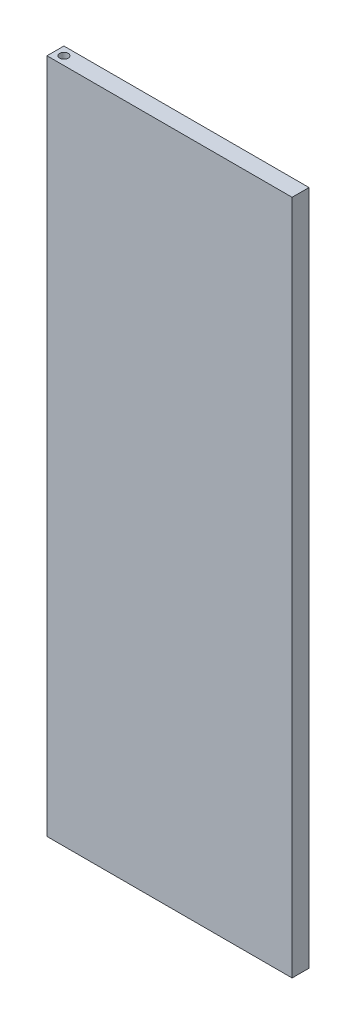
ISO-10303-21;
HEADER;
FILE_DESCRIPTION(('STEP AP214'),'2;1');
FILE_NAME('part.step','',(''),(''),'','','');
FILE_SCHEMA(('AUTOMOTIVE_DESIGN { 1 0 10303 214 1 1 1 1 }'));
ENDSEC;
DATA;
#1=APPLICATION_CONTEXT('core data for automotive mechanical design processes');
#2=APPLICATION_PROTOCOL_DEFINITION('international standard','automotive_design',2000,#1);
#3=PRODUCT_CONTEXT('',#1,'mechanical');
#4=PRODUCT('Part','Part','',(#3));
#5=PRODUCT_RELATED_PRODUCT_CATEGORY('part','',(#4));
#6=PRODUCT_DEFINITION_FORMATION('','',#4);
#7=PRODUCT_DEFINITION_CONTEXT('part definition',#1,'design');
#8=PRODUCT_DEFINITION('design','',#6,#7);
#9=PRODUCT_DEFINITION_SHAPE('','',#8);
#10=(LENGTH_UNIT() NAMED_UNIT(*) SI_UNIT(.MILLI.,.METRE.));
#11=(NAMED_UNIT(*) PLANE_ANGLE_UNIT() SI_UNIT($,.RADIAN.));
#12=(NAMED_UNIT(*) SI_UNIT($,.STERADIAN.) SOLID_ANGLE_UNIT());
#13=UNCERTAINTY_MEASURE_WITH_UNIT(LENGTH_MEASURE(1.E-05),#10,'distance_accuracy_value','');
#14=(GEOMETRIC_REPRESENTATION_CONTEXT(3) GLOBAL_UNCERTAINTY_ASSIGNED_CONTEXT((#13)) GLOBAL_UNIT_ASSIGNED_CONTEXT((#10,
#11,#12)) REPRESENTATION_CONTEXT('',''));
#15=CARTESIAN_POINT('',(0.,0.,0.));
#16=DIRECTION('',(0.,0.,1.));
#17=DIRECTION('',(1.,0.,0.));
#18=AXIS2_PLACEMENT_3D('',#15,#16,#17);
#19=CARTESIAN_POINT('',(0.,-2000.,0.));
#20=DIRECTION('',(1.,0.,0.));
#21=DIRECTION('',(0.,0.,-1.));
#22=AXIS2_PLACEMENT_3D('',#19,#20,#21);
#23=PLANE('',#22);
#24=DIRECTION('',(0.,0.,-1.));
#25=VECTOR('',#24,1.);
#26=CARTESIAN_POINT('',(0.,0.,0.));
#27=LINE('',#26,#25);
#28=CARTESIAN_POINT('',(0.,0.,0.));
#29=VERTEX_POINT('',#28);
#30=CARTESIAN_POINT('',(0.,0.,-50.));
#31=VERTEX_POINT('',#30);
#32=EDGE_CURVE('E100',#29,#31,#27,.T.);
#33=ORIENTED_EDGE('',*,*,#32,.F.);
#34=DIRECTION('',(0.,1.,0.));
#35=VECTOR('',#34,1.);
#36=CARTESIAN_POINT('',(0.,-2000.,0.));
#37=LINE('',#36,#35);
#38=CARTESIAN_POINT('',(0.,-2000.,0.));
#39=VERTEX_POINT('',#38);
#40=EDGE_CURVE('E11',#39,#29,#37,.T.);
#41=ORIENTED_EDGE('',*,*,#40,.F.);
#42=DIRECTION('',(0.,0.,-1.));
#43=VECTOR('',#42,1.);
#44=CARTESIAN_POINT('',(0.,-2000.,0.));
#45=LINE('',#44,#43);
#46=CARTESIAN_POINT('',(0.,-2000.,-50.));
#47=VERTEX_POINT('',#46);
#48=EDGE_CURVE('E93',#39,#47,#45,.T.);
#49=ORIENTED_EDGE('',*,*,#48,.T.);
#50=DIRECTION('',(0.,1.,0.));
#51=VECTOR('',#50,1.);
#52=CARTESIAN_POINT('',(0.,-2000.,-50.));
#53=LINE('',#52,#51);
#54=EDGE_CURVE('E38',#47,#31,#53,.T.);
#55=ORIENTED_EDGE('',*,*,#54,.T.);
#56=EDGE_LOOP('',(#33,#41,#49,#55));
#57=FACE_BOUND('',#56,.T.);
#58=ADVANCED_FACE('F35',(#57),#23,.T.);
#59=CARTESIAN_POINT('',(0.,-2000.,0.));
#60=DIRECTION('',(0.,0.,1.));
#61=DIRECTION('',(1.,0.,0.));
#62=AXIS2_PLACEMENT_3D('',#59,#60,#61);
#63=PLANE('',#62);
#64=DIRECTION('',(1.,0.,0.));
#65=VECTOR('',#64,1.);
#66=CARTESIAN_POINT('',(0.,0.,0.));
#67=LINE('',#66,#65);
#68=CARTESIAN_POINT('',(-725.,0.,0.));
#69=VERTEX_POINT('',#68);
#70=EDGE_CURVE('E95',#69,#29,#67,.T.);
#71=ORIENTED_EDGE('',*,*,#70,.F.);
#72=DIRECTION('',(0.,1.,0.));
#73=VECTOR('',#72,1.);
#74=CARTESIAN_POINT('',(-725.,-2000.,0.));
#75=LINE('',#74,#73);
#76=CARTESIAN_POINT('',(-725.,-2000.,0.));
#77=VERTEX_POINT('',#76);
#78=EDGE_CURVE('E44',#77,#69,#75,.T.);
#79=ORIENTED_EDGE('',*,*,#78,.F.);
#80=DIRECTION('',(1.,0.,0.));
#81=VECTOR('',#80,1.);
#82=CARTESIAN_POINT('',(0.,-2000.,0.));
#83=LINE('',#82,#81);
#84=EDGE_CURVE('E90',#77,#39,#83,.T.);
#85=ORIENTED_EDGE('',*,*,#84,.T.);
#86=ORIENTED_EDGE('',*,*,#40,.T.);
#87=EDGE_LOOP('',(#71,#79,#85,#86));
#88=FACE_BOUND('',#87,.T.);
#89=ADVANCED_FACE('F111',(#88),#63,.T.);
#90=CARTESIAN_POINT('',(-725.,-2000.,0.));
#91=DIRECTION('',(-1.,0.,0.));
#92=DIRECTION('',(0.,0.,1.));
#93=AXIS2_PLACEMENT_3D('',#90,#91,#92);
#94=PLANE('',#93);
#95=DIRECTION('',(0.,0.,1.));
#96=VECTOR('',#95,1.);
#97=CARTESIAN_POINT('',(-725.,0.,0.));
#98=LINE('',#97,#96);
#99=CARTESIAN_POINT('',(-725.,0.,-49.9999999999999));
#100=VERTEX_POINT('',#99);
#101=EDGE_CURVE('E85',#100,#69,#98,.T.);
#102=ORIENTED_EDGE('',*,*,#101,.F.);
#103=DIRECTION('',(0.,1.,0.));
#104=VECTOR('',#103,1.);
#105=CARTESIAN_POINT('',(-725.,-2000.,-49.9999999999999));
#106=LINE('',#105,#104);
#107=CARTESIAN_POINT('',(-725.,-2000.,-49.9999999999999));
#108=VERTEX_POINT('',#107);
#109=EDGE_CURVE('E80',#108,#100,#106,.T.);
#110=ORIENTED_EDGE('',*,*,#109,.F.);
#111=DIRECTION('',(0.,0.,1.));
#112=VECTOR('',#111,1.);
#113=CARTESIAN_POINT('',(-725.,-2000.,0.));
#114=LINE('',#113,#112);
#115=EDGE_CURVE('E83',#108,#77,#114,.T.);
#116=ORIENTED_EDGE('',*,*,#115,.T.);
#117=ORIENTED_EDGE('',*,*,#78,.T.);
#118=EDGE_LOOP('',(#102,#110,#116,#117));
#119=FACE_BOUND('',#118,.T.);
#120=ADVANCED_FACE('F82',(#119),#94,.T.);
#121=CARTESIAN_POINT('',(0.,-2000.,-50.));
#122=DIRECTION('',(0.,0.,-1.));
#123=DIRECTION('',(-1.,0.,0.));
#124=AXIS2_PLACEMENT_3D('',#121,#122,#123);
#125=PLANE('',#124);
#126=DIRECTION('',(-1.,0.,0.));
#127=VECTOR('',#126,1.);
#128=CARTESIAN_POINT('',(0.,0.,-50.));
#129=LINE('',#128,#127);
#130=EDGE_CURVE('E103',#31,#100,#129,.T.);
#131=ORIENTED_EDGE('',*,*,#130,.F.);
#132=ORIENTED_EDGE('',*,*,#54,.F.);
#133=DIRECTION('',(-1.,0.,0.));
#134=VECTOR('',#133,1.);
#135=CARTESIAN_POINT('',(0.,-2000.,-50.));
#136=LINE('',#135,#134);
#137=EDGE_CURVE('E89',#47,#108,#136,.T.);
#138=ORIENTED_EDGE('',*,*,#137,.T.);
#139=ORIENTED_EDGE('',*,*,#109,.T.);
#140=EDGE_LOOP('',(#131,#132,#138,#139));
#141=FACE_BOUND('',#140,.T.);
#142=ADVANCED_FACE('F92',(#141),#125,.T.);
#143=CARTESIAN_POINT('',(0.,-2000.,0.));
#144=DIRECTION('',(0.,1.,0.));
#145=DIRECTION('',(0.,0.,1.));
#146=AXIS2_PLACEMENT_3D('',#143,#144,#145);
#147=PLANE('',#146);
#148=ORIENTED_EDGE('',*,*,#48,.F.);
#149=ORIENTED_EDGE('',*,*,#84,.F.);
#150=ORIENTED_EDGE('',*,*,#115,.F.);
#151=ORIENTED_EDGE('',*,*,#137,.F.);
#152=EDGE_LOOP('',(#148,#149,#150,#151));
#153=FACE_BOUND('',#152,.T.);
#154=ADVANCED_FACE('F88',(#153),#147,.F.);
#155=CARTESIAN_POINT('',(0.,0.,0.));
#156=DIRECTION('',(0.,1.,0.));
#157=DIRECTION('',(0.,0.,1.));
#158=AXIS2_PLACEMENT_3D('',#155,#156,#157);
#159=PLANE('',#158);
#160=CARTESIAN_POINT('',(-700.,0.,-25.));
#161=DIRECTION('',(0.,1.,0.));
#162=DIRECTION('',(0.,0.,1.));
#163=AXIS2_PLACEMENT_3D('',#160,#161,#162);
#164=CIRCLE('',#163,12.5);
#165=CARTESIAN_POINT('',(-700.,0.,-12.5));
#166=VERTEX_POINT('',#165);
#167=EDGE_CURVE('E141',#166,#166,#164,.T.);
#168=ORIENTED_EDGE('',*,*,#167,.F.);
#169=EDGE_LOOP('',(#168));
#170=FACE_BOUND('',#169,.T.);
#171=ORIENTED_EDGE('',*,*,#32,.T.);
#172=ORIENTED_EDGE('',*,*,#130,.T.);
#173=ORIENTED_EDGE('',*,*,#101,.T.);
#174=ORIENTED_EDGE('',*,*,#70,.T.);
#175=EDGE_LOOP('',(#171,#172,#173,#174));
#176=FACE_BOUND('',#175,.T.);
#177=ADVANCED_FACE('F110',(#170,#176),#159,.T.);
#178=CARTESIAN_POINT('',(-700.,-100.,-25.));
#179=DIRECTION('',(0.,1.,0.));
#180=DIRECTION('',(0.,0.,1.));
#181=AXIS2_PLACEMENT_3D('',#178,#179,#180);
#182=CYLINDRICAL_SURFACE('',#181,12.5);
#183=CARTESIAN_POINT('',(-700.,-100.,-25.));
#184=DIRECTION('',(0.,1.,0.));
#185=DIRECTION('',(0.,0.,1.));
#186=AXIS2_PLACEMENT_3D('',#183,#184,#185);
#187=CIRCLE('',#186,12.5);
#188=CARTESIAN_POINT('',(-700.,-100.,-12.5));
#189=VERTEX_POINT('',#188);
#190=EDGE_CURVE('E104',#189,#189,#187,.T.);
#191=ORIENTED_EDGE('',*,*,#190,.F.);
#192=EDGE_LOOP('',(#191));
#193=FACE_BOUND('',#192,.T.);
#194=ORIENTED_EDGE('',*,*,#167,.T.);
#195=EDGE_LOOP('',(#194));
#196=FACE_BOUND('',#195,.T.);
#197=ADVANCED_FACE('F128',(#193,#196),#182,.F.);
#198=CARTESIAN_POINT('',(-700.,-100.,-25.));
#199=DIRECTION('',(0.,1.,0.));
#200=DIRECTION('',(0.,0.,1.));
#201=AXIS2_PLACEMENT_3D('',#198,#199,#200);
#202=PLANE('',#201);
#203=ORIENTED_EDGE('',*,*,#190,.T.);
#204=EDGE_LOOP('',(#203));
#205=FACE_BOUND('',#204,.T.);
#206=ADVANCED_FACE('F133',(#205),#202,.T.);
#207=CLOSED_SHELL('',(#58,#89,#120,#142,#154,#177,#197,#206));
#208=MANIFOLD_SOLID_BREP('B2',#207);
#209=ADVANCED_BREP_SHAPE_REPRESENTATION('',(#18,#208),#14);
#210=SHAPE_DEFINITION_REPRESENTATION(#9,#209);
ENDSEC;
END-ISO-10303-21;
